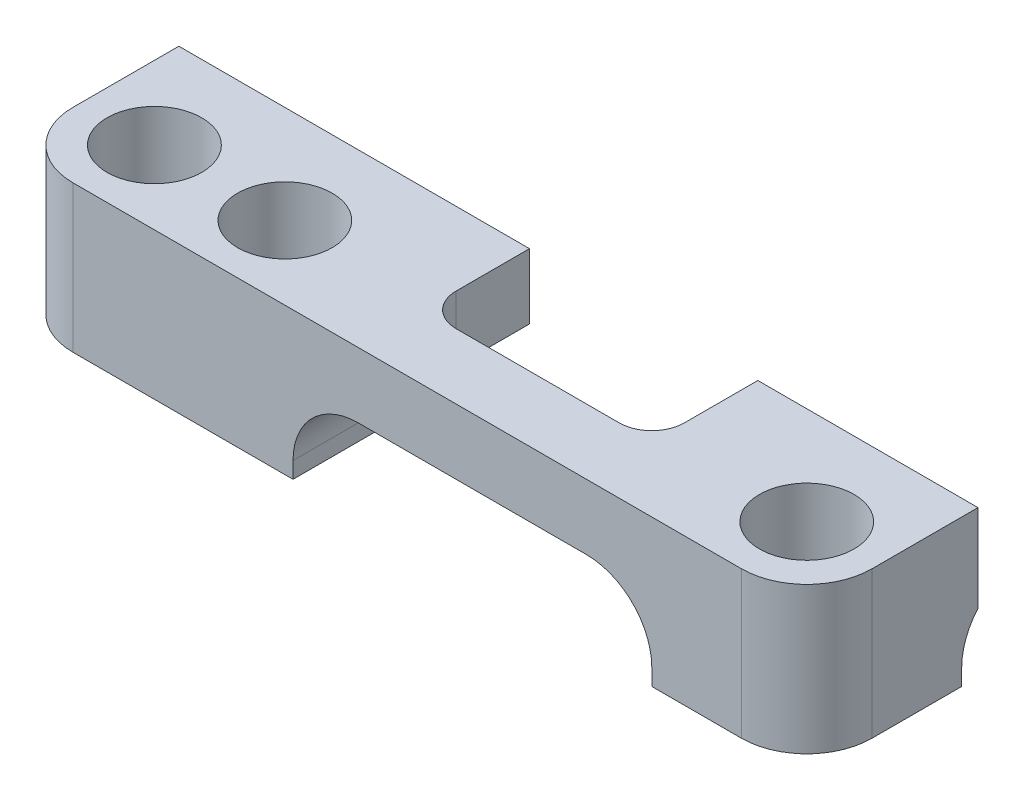
ISO-10303-21;
HEADER;
FILE_DESCRIPTION(('STEP AP214'),'2;1');
FILE_NAME('part.step','',(''),(''),'','','');
FILE_SCHEMA(('AUTOMOTIVE_DESIGN { 1 0 10303 214 1 1 1 1 }'));
ENDSEC;
DATA;
#1=APPLICATION_CONTEXT('core data for automotive mechanical design processes');
#2=APPLICATION_PROTOCOL_DEFINITION('international standard','automotive_design',2000,#1);
#3=PRODUCT_CONTEXT('',#1,'mechanical');
#4=PRODUCT('Part','Part','',(#3));
#5=PRODUCT_RELATED_PRODUCT_CATEGORY('part','',(#4));
#6=PRODUCT_DEFINITION_FORMATION('','',#4);
#7=PRODUCT_DEFINITION_CONTEXT('part definition',#1,'design');
#8=PRODUCT_DEFINITION('design','',#6,#7);
#9=PRODUCT_DEFINITION_SHAPE('','',#8);
#10=(LENGTH_UNIT() NAMED_UNIT(*) SI_UNIT(.MILLI.,.METRE.));
#11=(NAMED_UNIT(*) PLANE_ANGLE_UNIT() SI_UNIT($,.RADIAN.));
#12=(NAMED_UNIT(*) SI_UNIT($,.STERADIAN.) SOLID_ANGLE_UNIT());
#13=UNCERTAINTY_MEASURE_WITH_UNIT(LENGTH_MEASURE(1.E-05),#10,'distance_accuracy_value','');
#14=(GEOMETRIC_REPRESENTATION_CONTEXT(3) GLOBAL_UNCERTAINTY_ASSIGNED_CONTEXT((#13)) GLOBAL_UNIT_ASSIGNED_CONTEXT((#10,
#11,#12)) REPRESENTATION_CONTEXT('',''));
#15=CARTESIAN_POINT('',(0.,0.,0.));
#16=DIRECTION('',(0.,0.,1.));
#17=DIRECTION('',(1.,0.,0.));
#18=AXIS2_PLACEMENT_3D('',#15,#16,#17);
#19=CARTESIAN_POINT('',(0.,0.,0.));
#20=DIRECTION('',(0.,-1.,0.));
#21=DIRECTION('',(0.,0.,-1.));
#22=AXIS2_PLACEMENT_3D('',#19,#20,#21);
#23=PLANE('',#22);
#24=DIRECTION('',(1.,0.,0.));
#25=VECTOR('',#24,1.);
#26=CARTESIAN_POINT('',(10.25,0.,7.25));
#27=LINE('',#26,#25);
#28=CARTESIAN_POINT('',(-12.25,0.,7.25));
#29=VERTEX_POINT('',#28);
#30=CARTESIAN_POINT('',(-5.5,0.,7.25));
#31=VERTEX_POINT('',#30);
#32=EDGE_CURVE('E206',#29,#31,#27,.T.);
#33=ORIENTED_EDGE('',*,*,#32,.F.);
#34=CARTESIAN_POINT('',(-12.25,0.,5.25));
#35=DIRECTION('',(0.,-1.,0.));
#36=DIRECTION('',(0.,0.,-1.));
#37=AXIS2_PLACEMENT_3D('',#34,#35,#36);
#38=CIRCLE('',#37,2.);
#39=CARTESIAN_POINT('',(-14.25,0.,5.25));
#40=VERTEX_POINT('',#39);
#41=EDGE_CURVE('E247',#29,#40,#38,.T.);
#42=ORIENTED_EDGE('',*,*,#41,.T.);
#43=DIRECTION('',(0.,0.,1.));
#44=VECTOR('',#43,1.);
#45=CARTESIAN_POINT('',(-14.25,0.,7.25));
#46=LINE('',#45,#44);
#47=CARTESIAN_POINT('',(-14.25,0.,2.5));
#48=VERTEX_POINT('',#47);
#49=EDGE_CURVE('E212',#48,#40,#46,.T.);
#50=ORIENTED_EDGE('',*,*,#49,.F.);
#51=DIRECTION('',(-1.,0.,0.));
#52=VECTOR('',#51,1.);
#53=CARTESIAN_POINT('',(10.25,0.,2.5));
#54=LINE('',#53,#52);
#55=CARTESIAN_POINT('',(-5.5,0.,2.5));
#56=VERTEX_POINT('',#55);
#57=EDGE_CURVE('E327',#56,#48,#54,.T.);
#58=ORIENTED_EDGE('',*,*,#57,.F.);
#59=DIRECTION('',(0.,0.,1.));
#60=VECTOR('',#59,1.);
#61=CARTESIAN_POINT('',(-5.5,0.,-7.25));
#62=LINE('',#61,#60);
#63=EDGE_CURVE('E318',#56,#31,#62,.T.);
#64=ORIENTED_EDGE('',*,*,#63,.T.);
#65=EDGE_LOOP('',(#33,#42,#50,#58,#64));
#66=FACE_BOUND('',#65,.T.);
#67=CARTESIAN_POINT('',(-12.,0.,4.99999999999999));
#68=DIRECTION('',(0.,1.,0.));
#69=DIRECTION('',(0.,0.,1.));
#70=AXIS2_PLACEMENT_3D('',#67,#68,#69);
#71=CIRCLE('',#70,1.45208286644588);
#72=CARTESIAN_POINT('',(-12.,0.,6.45208286644587));
#73=VERTEX_POINT('',#72);
#74=EDGE_CURVE('E333',#73,#73,#71,.T.);
#75=ORIENTED_EDGE('',*,*,#74,.T.);
#76=EDGE_LOOP('',(#75));
#77=FACE_BOUND('',#76,.T.);
#78=CARTESIAN_POINT('',(-8.,0.,5.));
#79=DIRECTION('',(0.,1.,0.));
#80=DIRECTION('',(0.,0.,1.));
#81=AXIS2_PLACEMENT_3D('',#78,#79,#80);
#82=CIRCLE('',#81,1.45);
#83=CARTESIAN_POINT('',(-8.,0.,6.45));
#84=VERTEX_POINT('',#83);
#85=EDGE_CURVE('E343',#84,#84,#82,.T.);
#86=ORIENTED_EDGE('',*,*,#85,.T.);
#87=EDGE_LOOP('',(#86));
#88=FACE_BOUND('',#87,.T.);
#89=ADVANCED_FACE('F39',(#66,#77,#88),#23,.T.);
#90=CARTESIAN_POINT('',(10.25,0.,2.5));
#91=DIRECTION('',(0.,0.,1.));
#92=DIRECTION('',(1.,0.,0.));
#93=AXIS2_PLACEMENT_3D('',#90,#91,#92);
#94=PLANE('',#93);
#95=DIRECTION('',(0.,1.,0.));
#96=VECTOR('',#95,1.);
#97=CARTESIAN_POINT('',(-14.25,0.,2.5));
#98=LINE('',#97,#96);
#99=CARTESIAN_POINT('',(-14.25,0.5,2.5));
#100=VERTEX_POINT('',#99);
#101=EDGE_CURVE('E321',#48,#100,#98,.T.);
#102=ORIENTED_EDGE('',*,*,#101,.T.);
#103=DIRECTION('',(-1.,0.,0.));
#104=VECTOR('',#103,1.);
#105=CARTESIAN_POINT('',(-5.50000000000001,0.5,2.5));
#106=LINE('',#105,#104);
#107=CARTESIAN_POINT('',(-5.50000000000001,0.5,2.5));
#108=VERTEX_POINT('',#107);
#109=EDGE_CURVE('E270',#100,#108,#106,.F.);
#110=ORIENTED_EDGE('',*,*,#109,.T.);
#111=DIRECTION('',(0.,-1.,0.));
#112=VECTOR('',#111,1.);
#113=CARTESIAN_POINT('',(-5.50000000000001,0.,2.5));
#114=LINE('',#113,#112);
#115=EDGE_CURVE('E220',#108,#56,#114,.T.);
#116=ORIENTED_EDGE('',*,*,#115,.T.);
#117=ORIENTED_EDGE('',*,*,#57,.T.);
#118=EDGE_LOOP('',(#102,#110,#116,#117));
#119=FACE_BOUND('',#118,.T.);
#120=ADVANCED_FACE('F368',(#119),#94,.F.);
#121=CARTESIAN_POINT('',(0.,4.5,0.));
#122=DIRECTION('',(0.,-1.,0.));
#123=DIRECTION('',(0.,0.,-1.));
#124=AXIS2_PLACEMENT_3D('',#121,#122,#123);
#125=PLANE('',#124);
#126=DIRECTION('',(0.,0.,-1.));
#127=VECTOR('',#126,1.);
#128=CARTESIAN_POINT('',(10.25,4.5,-7.25));
#129=LINE('',#128,#127);
#130=CARTESIAN_POINT('',(10.25,4.5,5.25));
#131=VERTEX_POINT('',#130);
#132=CARTESIAN_POINT('',(10.25,4.5,2.));
#133=VERTEX_POINT('',#132);
#134=EDGE_CURVE('E201',#131,#133,#129,.T.);
#135=ORIENTED_EDGE('',*,*,#134,.T.);
#136=DIRECTION('',(1.,0.,0.));
#137=VECTOR('',#136,1.);
#138=CARTESIAN_POINT('',(-15.2422142422142,4.5,2.));
#139=LINE('',#138,#137);
#140=CARTESIAN_POINT('',(3.49999999999999,4.5,2.));
#141=VERTEX_POINT('',#140);
#142=EDGE_CURVE('E193',#141,#133,#139,.T.);
#143=ORIENTED_EDGE('',*,*,#142,.F.);
#144=DIRECTION('',(0.,0.,1.));
#145=VECTOR('',#144,1.);
#146=CARTESIAN_POINT('',(3.5,4.5,0.5));
#147=LINE('',#146,#145);
#148=CARTESIAN_POINT('',(3.5,4.5,4.25));
#149=VERTEX_POINT('',#148);
#150=EDGE_CURVE('E297',#141,#149,#147,.T.);
#151=ORIENTED_EDGE('',*,*,#150,.T.);
#152=CARTESIAN_POINT('',(2.5,4.5,4.25));
#153=DIRECTION('',(0.,-1.,0.));
#154=DIRECTION('',(0.,0.,-1.));
#155=AXIS2_PLACEMENT_3D('',#152,#153,#154);
#156=CIRCLE('',#155,1.);
#157=CARTESIAN_POINT('',(2.5,4.5,5.25));
#158=VERTEX_POINT('',#157);
#159=EDGE_CURVE('E236',#149,#158,#156,.T.);
#160=ORIENTED_EDGE('',*,*,#159,.T.);
#161=DIRECTION('',(-1.,0.,0.));
#162=VECTOR('',#161,1.);
#163=CARTESIAN_POINT('',(3.5,4.5,5.25));
#164=LINE('',#163,#162);
#165=CARTESIAN_POINT('',(-2.5,4.5,5.25));
#166=VERTEX_POINT('',#165);
#167=EDGE_CURVE('E299',#158,#166,#164,.T.);
#168=ORIENTED_EDGE('',*,*,#167,.T.);
#169=CARTESIAN_POINT('',(-2.5,4.5,4.25));
#170=DIRECTION('',(0.,-1.,0.));
#171=DIRECTION('',(0.,0.,-1.));
#172=AXIS2_PLACEMENT_3D('',#169,#170,#171);
#173=CIRCLE('',#172,1.);
#174=CARTESIAN_POINT('',(-3.5,4.5,4.25));
#175=VERTEX_POINT('',#174);
#176=EDGE_CURVE('E240',#166,#175,#173,.T.);
#177=ORIENTED_EDGE('',*,*,#176,.T.);
#178=DIRECTION('',(0.,0.,-1.));
#179=VECTOR('',#178,1.);
#180=CARTESIAN_POINT('',(-3.5,4.5,5.25));
#181=LINE('',#180,#179);
#182=CARTESIAN_POINT('',(-3.50000000000001,4.5,2.));
#183=VERTEX_POINT('',#182);
#184=EDGE_CURVE('E192',#175,#183,#181,.T.);
#185=ORIENTED_EDGE('',*,*,#184,.T.);
#186=CARTESIAN_POINT('',(-14.25,4.5,2.));
#187=VERTEX_POINT('',#186);
#188=EDGE_CURVE('E176',#187,#183,#139,.T.);
#189=ORIENTED_EDGE('',*,*,#188,.F.);
#190=DIRECTION('',(0.,0.,1.));
#191=VECTOR('',#190,1.);
#192=CARTESIAN_POINT('',(-14.25,4.5,7.25));
#193=LINE('',#192,#191);
#194=CARTESIAN_POINT('',(-14.25,4.5,5.25));
#195=VERTEX_POINT('',#194);
#196=EDGE_CURVE('E189',#187,#195,#193,.T.);
#197=ORIENTED_EDGE('',*,*,#196,.T.);
#198=CARTESIAN_POINT('',(-12.25,4.5,5.25));
#199=DIRECTION('',(0.,-1.,0.));
#200=DIRECTION('',(0.,0.,-1.));
#201=AXIS2_PLACEMENT_3D('',#198,#199,#200);
#202=CIRCLE('',#201,2.);
#203=CARTESIAN_POINT('',(-12.25,4.5,7.25));
#204=VERTEX_POINT('',#203);
#205=EDGE_CURVE('E252',#195,#204,#202,.F.);
#206=ORIENTED_EDGE('',*,*,#205,.T.);
#207=DIRECTION('',(1.,0.,0.));
#208=VECTOR('',#207,1.);
#209=CARTESIAN_POINT('',(-10.25,4.5,7.25));
#210=LINE('',#209,#208);
#211=CARTESIAN_POINT('',(8.25,4.5,7.25));
#212=VERTEX_POINT('',#211);
#213=EDGE_CURVE('E200',#204,#212,#210,.T.);
#214=ORIENTED_EDGE('',*,*,#213,.T.);
#215=CARTESIAN_POINT('',(8.25,4.5,5.25));
#216=DIRECTION('',(0.,-1.,0.));
#217=DIRECTION('',(0.,0.,-1.));
#218=AXIS2_PLACEMENT_3D('',#215,#216,#217);
#219=CIRCLE('',#218,2.);
#220=EDGE_CURVE('E250',#212,#131,#219,.F.);
#221=ORIENTED_EDGE('',*,*,#220,.T.);
#222=EDGE_LOOP('',(#135,#143,#151,#160,#168,#177,#185,#189,#197,#206,#214,#221));
#223=FACE_BOUND('',#222,.T.);
#224=CARTESIAN_POINT('',(-8.,4.5,5.));
#225=DIRECTION('',(0.,1.,0.));
#226=DIRECTION('',(0.,0.,1.));
#227=AXIS2_PLACEMENT_3D('',#224,#225,#226);
#228=CIRCLE('',#227,1.45);
#229=CARTESIAN_POINT('',(-8.,4.5,6.45));
#230=VERTEX_POINT('',#229);
#231=EDGE_CURVE('E213',#230,#230,#228,.T.);
#232=ORIENTED_EDGE('',*,*,#231,.F.);
#233=EDGE_LOOP('',(#232));
#234=FACE_BOUND('',#233,.T.);
#235=CARTESIAN_POINT('',(8.,4.5,5.));
#236=DIRECTION('',(0.,1.,0.));
#237=DIRECTION('',(0.,0.,-1.));
#238=AXIS2_PLACEMENT_3D('',#235,#236,#237);
#239=CIRCLE('',#238,1.45);
#240=CARTESIAN_POINT('',(8.,4.5,3.55));
#241=VERTEX_POINT('',#240);
#242=EDGE_CURVE('E340',#241,#241,#239,.T.);
#243=ORIENTED_EDGE('',*,*,#242,.F.);
#244=EDGE_LOOP('',(#243));
#245=FACE_BOUND('',#244,.T.);
#246=CARTESIAN_POINT('',(-12.,4.5,4.99999999999999));
#247=DIRECTION('',(0.,1.,0.));
#248=DIRECTION('',(0.,0.,1.));
#249=AXIS2_PLACEMENT_3D('',#246,#247,#248);
#250=CIRCLE('',#249,1.45208286644588);
#251=CARTESIAN_POINT('',(-12.,4.5,6.45208286644587));
#252=VERTEX_POINT('',#251);
#253=EDGE_CURVE('E334',#252,#252,#250,.T.);
#254=ORIENTED_EDGE('',*,*,#253,.F.);
#255=EDGE_LOOP('',(#254));
#256=FACE_BOUND('',#255,.T.);
#257=ADVANCED_FACE('F187',(#223,#234,#245,#256),#125,.F.);
#258=DIRECTION('',(0.,0.,-1.));
#259=VECTOR('',#258,1.);
#260=CARTESIAN_POINT('',(10.25,0.,-7.25));
#261=LINE('',#260,#259);
#262=CARTESIAN_POINT('',(10.25,0.,5.25));
#263=VERTEX_POINT('',#262);
#264=CARTESIAN_POINT('',(10.25,0.,2.5));
#265=VERTEX_POINT('',#264);
#266=EDGE_CURVE('E210',#263,#265,#261,.T.);
#267=ORIENTED_EDGE('',*,*,#266,.F.);
#268=CARTESIAN_POINT('',(8.25,0.,5.25));
#269=DIRECTION('',(0.,-1.,0.));
#270=DIRECTION('',(0.,0.,-1.));
#271=AXIS2_PLACEMENT_3D('',#268,#269,#270);
#272=CIRCLE('',#271,2.);
#273=CARTESIAN_POINT('',(8.25,0.,7.25));
#274=VERTEX_POINT('',#273);
#275=EDGE_CURVE('E257',#263,#274,#272,.T.);
#276=ORIENTED_EDGE('',*,*,#275,.T.);
#277=CARTESIAN_POINT('',(5.5,0.,7.25));
#278=VERTEX_POINT('',#277);
#279=EDGE_CURVE('E215',#278,#274,#27,.T.);
#280=ORIENTED_EDGE('',*,*,#279,.F.);
#281=DIRECTION('',(0.,0.,1.));
#282=VECTOR('',#281,1.);
#283=CARTESIAN_POINT('',(5.5,0.,-7.25));
#284=LINE('',#283,#282);
#285=CARTESIAN_POINT('',(5.5,0.,2.5));
#286=VERTEX_POINT('',#285);
#287=EDGE_CURVE('E319',#286,#278,#284,.T.);
#288=ORIENTED_EDGE('',*,*,#287,.F.);
#289=EDGE_CURVE('E330',#265,#286,#54,.T.);
#290=ORIENTED_EDGE('',*,*,#289,.F.);
#291=EDGE_LOOP('',(#267,#276,#280,#288,#290));
#292=FACE_BOUND('',#291,.T.);
#293=CARTESIAN_POINT('',(8.,0.,5.));
#294=DIRECTION('',(0.,1.,0.));
#295=DIRECTION('',(0.,0.,-1.));
#296=AXIS2_PLACEMENT_3D('',#293,#294,#295);
#297=CIRCLE('',#296,1.45);
#298=CARTESIAN_POINT('',(8.,0.,3.55));
#299=VERTEX_POINT('',#298);
#300=EDGE_CURVE('E337',#299,#299,#297,.T.);
#301=ORIENTED_EDGE('',*,*,#300,.T.);
#302=EDGE_LOOP('',(#301));
#303=FACE_BOUND('',#302,.T.);
#304=ADVANCED_FACE('F371',(#292,#303),#23,.T.);
#305=CARTESIAN_POINT('',(10.25,4.5,-7.25));
#306=DIRECTION('',(-1.,0.,0.));
#307=DIRECTION('',(0.,0.,1.));
#308=AXIS2_PLACEMENT_3D('',#305,#306,#307);
#309=PLANE('',#308);
#310=CARTESIAN_POINT('',(10.25,0.5,0.5));
#311=DIRECTION('',(-1.,0.,0.));
#312=DIRECTION('',(0.,0.,1.));
#313=AXIS2_PLACEMENT_3D('',#310,#311,#312);
#314=CIRCLE('',#313,2.);
#315=CARTESIAN_POINT('',(10.25,0.5,2.5));
#316=VERTEX_POINT('',#315);
#317=CARTESIAN_POINT('',(10.25,1.8228756555323,2.));
#318=VERTEX_POINT('',#317);
#319=EDGE_CURVE('E272',#316,#318,#314,.T.);
#320=ORIENTED_EDGE('',*,*,#319,.T.);
#321=DIRECTION('',(0.,1.,0.));
#322=VECTOR('',#321,1.);
#323=CARTESIAN_POINT('',(10.25,4.5,2.));
#324=LINE('',#323,#322);
#325=EDGE_CURVE('E54',#318,#133,#324,.T.);
#326=ORIENTED_EDGE('',*,*,#325,.T.);
#327=ORIENTED_EDGE('',*,*,#134,.F.);
#328=DIRECTION('',(0.,-1.,0.));
#329=VECTOR('',#328,1.);
#330=CARTESIAN_POINT('',(10.25,4.5,5.25));
#331=LINE('',#330,#329);
#332=EDGE_CURVE('E254',#131,#263,#331,.T.);
#333=ORIENTED_EDGE('',*,*,#332,.T.);
#334=ORIENTED_EDGE('',*,*,#266,.T.);
#335=DIRECTION('',(0.,1.,0.));
#336=VECTOR('',#335,1.);
#337=CARTESIAN_POINT('',(10.25,0.,2.5));
#338=LINE('',#337,#336);
#339=EDGE_CURVE('E324',#265,#316,#338,.T.);
#340=ORIENTED_EDGE('',*,*,#339,.T.);
#341=EDGE_LOOP('',(#320,#326,#327,#333,#334,#340));
#342=FACE_BOUND('',#341,.T.);
#343=ADVANCED_FACE('F382',(#342),#309,.F.);
#344=CARTESIAN_POINT('',(-14.25,4.5,7.25));
#345=DIRECTION('',(1.,0.,0.));
#346=DIRECTION('',(0.,0.,-1.));
#347=AXIS2_PLACEMENT_3D('',#344,#345,#346);
#348=PLANE('',#347);
#349=ORIENTED_EDGE('',*,*,#196,.F.);
#350=DIRECTION('',(0.,-1.,0.));
#351=VECTOR('',#350,1.);
#352=CARTESIAN_POINT('',(-14.25,4.5,2.));
#353=LINE('',#352,#351);
#354=CARTESIAN_POINT('',(-14.25,1.8228756555323,2.));
#355=VERTEX_POINT('',#354);
#356=EDGE_CURVE('E173',#187,#355,#353,.T.);
#357=ORIENTED_EDGE('',*,*,#356,.T.);
#358=CARTESIAN_POINT('',(-14.25,0.5,0.5));
#359=DIRECTION('',(1.,0.,0.));
#360=DIRECTION('',(0.,0.,-1.));
#361=AXIS2_PLACEMENT_3D('',#358,#359,#360);
#362=CIRCLE('',#361,2.);
#363=EDGE_CURVE('E47',#355,#100,#362,.T.);
#364=ORIENTED_EDGE('',*,*,#363,.T.);
#365=ORIENTED_EDGE('',*,*,#101,.F.);
#366=ORIENTED_EDGE('',*,*,#49,.T.);
#367=DIRECTION('',(0.,-1.,0.));
#368=VECTOR('',#367,1.);
#369=CARTESIAN_POINT('',(-14.25,4.5,5.25));
#370=LINE('',#369,#368);
#371=EDGE_CURVE('E198',#40,#195,#370,.F.);
#372=ORIENTED_EDGE('',*,*,#371,.T.);
#373=EDGE_LOOP('',(#349,#357,#364,#365,#366,#372));
#374=FACE_BOUND('',#373,.T.);
#375=ADVANCED_FACE('F195',(#374),#348,.F.);
#376=CARTESIAN_POINT('',(10.25,4.5,7.25));
#377=DIRECTION('',(0.,0.,-1.));
#378=DIRECTION('',(-1.,0.,0.));
#379=AXIS2_PLACEMENT_3D('',#376,#377,#378);
#380=PLANE('',#379);
#381=ORIENTED_EDGE('',*,*,#213,.F.);
#382=DIRECTION('',(0.,-1.,0.));
#383=VECTOR('',#382,1.);
#384=CARTESIAN_POINT('',(-12.25,4.5,7.25));
#385=LINE('',#384,#383);
#386=EDGE_CURVE('E244',#204,#29,#385,.T.);
#387=ORIENTED_EDGE('',*,*,#386,.T.);
#388=ORIENTED_EDGE('',*,*,#32,.T.);
#389=DIRECTION('',(0.,-1.,0.));
#390=VECTOR('',#389,1.);
#391=CARTESIAN_POINT('',(-5.5,0.,7.25));
#392=LINE('',#391,#390);
#393=CARTESIAN_POINT('',(-5.5,0.5,7.25));
#394=VERTEX_POINT('',#393);
#395=EDGE_CURVE('E304',#394,#31,#392,.T.);
#396=ORIENTED_EDGE('',*,*,#395,.F.);
#397=CARTESIAN_POINT('',(-3.5,0.5,7.25));
#398=DIRECTION('',(0.,0.,-1.));
#399=DIRECTION('',(-1.,0.,0.));
#400=AXIS2_PLACEMENT_3D('',#397,#398,#399);
#401=CIRCLE('',#400,2.);
#402=CARTESIAN_POINT('',(-3.5,2.5,7.25));
#403=VERTEX_POINT('',#402);
#404=EDGE_CURVE('E277',#394,#403,#401,.T.);
#405=ORIENTED_EDGE('',*,*,#404,.T.);
#406=DIRECTION('',(-1.,0.,0.));
#407=VECTOR('',#406,1.);
#408=CARTESIAN_POINT('',(-5.5,2.5,7.25));
#409=LINE('',#408,#407);
#410=CARTESIAN_POINT('',(3.5,2.5,7.25));
#411=VERTEX_POINT('',#410);
#412=EDGE_CURVE('E315',#411,#403,#409,.T.);
#413=ORIENTED_EDGE('',*,*,#412,.F.);
#414=CARTESIAN_POINT('',(3.5,0.5,7.25));
#415=DIRECTION('',(0.,0.,-1.));
#416=DIRECTION('',(-1.,0.,0.));
#417=AXIS2_PLACEMENT_3D('',#414,#415,#416);
#418=CIRCLE('',#417,2.);
#419=CARTESIAN_POINT('',(5.5,0.5,7.25));
#420=VERTEX_POINT('',#419);
#421=EDGE_CURVE('E275',#411,#420,#418,.T.);
#422=ORIENTED_EDGE('',*,*,#421,.T.);
#423=DIRECTION('',(0.,1.,0.));
#424=VECTOR('',#423,1.);
#425=CARTESIAN_POINT('',(5.5,0.,7.25));
#426=LINE('',#425,#424);
#427=EDGE_CURVE('E312',#278,#420,#426,.T.);
#428=ORIENTED_EDGE('',*,*,#427,.F.);
#429=ORIENTED_EDGE('',*,*,#279,.T.);
#430=DIRECTION('',(0.,-1.,0.));
#431=VECTOR('',#430,1.);
#432=CARTESIAN_POINT('',(8.25,4.5,7.25));
#433=LINE('',#432,#431);
#434=EDGE_CURVE('E242',#274,#212,#433,.F.);
#435=ORIENTED_EDGE('',*,*,#434,.T.);
#436=EDGE_LOOP('',(#381,#387,#388,#396,#405,#413,#422,#428,#429,#435));
#437=FACE_BOUND('',#436,.T.);
#438=ADVANCED_FACE('F354',(#437),#380,.F.);
#439=CARTESIAN_POINT('',(-8.,4.5,5.));
#440=DIRECTION('',(0.,-1.,0.));
#441=DIRECTION('',(0.,0.,-1.));
#442=AXIS2_PLACEMENT_3D('',#439,#440,#441);
#443=CYLINDRICAL_SURFACE('',#442,1.45);
#444=ORIENTED_EDGE('',*,*,#231,.T.);
#445=EDGE_LOOP('',(#444));
#446=FACE_BOUND('',#445,.T.);
#447=ORIENTED_EDGE('',*,*,#85,.F.);
#448=EDGE_LOOP('',(#447));
#449=FACE_BOUND('',#448,.T.);
#450=ADVANCED_FACE('F351',(#446,#449),#443,.F.);
#451=CARTESIAN_POINT('',(8.,4.5,5.));
#452=DIRECTION('',(0.,-1.,0.));
#453=DIRECTION('',(0.,0.,-1.));
#454=AXIS2_PLACEMENT_3D('',#451,#452,#453);
#455=CYLINDRICAL_SURFACE('',#454,1.45);
#456=ORIENTED_EDGE('',*,*,#242,.T.);
#457=EDGE_LOOP('',(#456));
#458=FACE_BOUND('',#457,.T.);
#459=ORIENTED_EDGE('',*,*,#300,.F.);
#460=EDGE_LOOP('',(#459));
#461=FACE_BOUND('',#460,.T.);
#462=ADVANCED_FACE('F353',(#458,#461),#455,.F.);
#463=CARTESIAN_POINT('',(-12.,4.5,4.99999999999999));
#464=DIRECTION('',(0.,-1.,0.));
#465=DIRECTION('',(0.,0.,-1.));
#466=AXIS2_PLACEMENT_3D('',#463,#464,#465);
#467=CYLINDRICAL_SURFACE('',#466,1.45208286644588);
#468=ORIENTED_EDGE('',*,*,#253,.T.);
#469=EDGE_LOOP('',(#468));
#470=FACE_BOUND('',#469,.T.);
#471=ORIENTED_EDGE('',*,*,#74,.F.);
#472=EDGE_LOOP('',(#471));
#473=FACE_BOUND('',#472,.T.);
#474=ADVANCED_FACE('F360',(#470,#473),#467,.F.);
#475=CARTESIAN_POINT('',(10.25,2.5,-5.25));
#476=DIRECTION('',(0.,1.,0.));
#477=DIRECTION('',(0.,0.,1.));
#478=AXIS2_PLACEMENT_3D('',#475,#476,#477);
#479=PLANE('',#478);
#480=CARTESIAN_POINT('',(2.5,2.5,4.25));
#481=DIRECTION('',(0.,1.,0.));
#482=DIRECTION('',(0.,0.,1.));
#483=AXIS2_PLACEMENT_3D('',#480,#481,#482);
#484=CIRCLE('',#483,1.);
#485=CARTESIAN_POINT('',(2.5,2.5,5.25));
#486=VERTEX_POINT('',#485);
#487=CARTESIAN_POINT('',(3.5,2.5,4.25));
#488=VERTEX_POINT('',#487);
#489=EDGE_CURVE('E233',#486,#488,#484,.T.);
#490=ORIENTED_EDGE('',*,*,#489,.T.);
#491=DIRECTION('',(0.,0.,1.));
#492=VECTOR('',#491,1.);
#493=CARTESIAN_POINT('',(3.5,2.5,7.25));
#494=LINE('',#493,#492);
#495=EDGE_CURVE('E261',#488,#411,#494,.T.);
#496=ORIENTED_EDGE('',*,*,#495,.T.);
#497=ORIENTED_EDGE('',*,*,#412,.T.);
#498=DIRECTION('',(0.,0.,1.));
#499=VECTOR('',#498,1.);
#500=CARTESIAN_POINT('',(-3.5,2.5,2.5));
#501=LINE('',#500,#499);
#502=CARTESIAN_POINT('',(-3.5,2.5,4.25));
#503=VERTEX_POINT('',#502);
#504=EDGE_CURVE('E259',#403,#503,#501,.F.);
#505=ORIENTED_EDGE('',*,*,#504,.T.);
#506=CARTESIAN_POINT('',(-2.5,2.5,4.25));
#507=DIRECTION('',(0.,1.,0.));
#508=DIRECTION('',(0.,0.,1.));
#509=AXIS2_PLACEMENT_3D('',#506,#507,#508);
#510=CIRCLE('',#509,1.);
#511=CARTESIAN_POINT('',(-2.5,2.5,5.25));
#512=VERTEX_POINT('',#511);
#513=EDGE_CURVE('E238',#503,#512,#510,.T.);
#514=ORIENTED_EDGE('',*,*,#513,.T.);
#515=DIRECTION('',(-1.,0.,0.));
#516=VECTOR('',#515,1.);
#517=CARTESIAN_POINT('',(3.5,2.5,5.25));
#518=LINE('',#517,#516);
#519=EDGE_CURVE('E306',#486,#512,#518,.T.);
#520=ORIENTED_EDGE('',*,*,#519,.F.);
#521=EDGE_LOOP('',(#490,#496,#497,#505,#514,#520));
#522=FACE_BOUND('',#521,.T.);
#523=ADVANCED_FACE('F558',(#522),#479,.F.);
#524=DIRECTION('',(0.,1.,0.));
#525=VECTOR('',#524,1.);
#526=CARTESIAN_POINT('',(5.5,0.,2.5));
#527=LINE('',#526,#525);
#528=CARTESIAN_POINT('',(5.5,0.5,2.5));
#529=VERTEX_POINT('',#528);
#530=EDGE_CURVE('E204',#286,#529,#527,.T.);
#531=ORIENTED_EDGE('',*,*,#530,.T.);
#532=DIRECTION('',(-1.,0.,0.));
#533=VECTOR('',#532,1.);
#534=CARTESIAN_POINT('',(10.25,0.5,2.5));
#535=LINE('',#534,#533);
#536=EDGE_CURVE('E263',#529,#316,#535,.F.);
#537=ORIENTED_EDGE('',*,*,#536,.T.);
#538=ORIENTED_EDGE('',*,*,#339,.F.);
#539=ORIENTED_EDGE('',*,*,#289,.T.);
#540=EDGE_LOOP('',(#531,#537,#538,#539));
#541=FACE_BOUND('',#540,.T.);
#542=ADVANCED_FACE('F379',(#541),#94,.F.);
#543=CARTESIAN_POINT('',(5.5,0.,-7.25));
#544=DIRECTION('',(1.,0.,0.));
#545=DIRECTION('',(0.,0.,-1.));
#546=AXIS2_PLACEMENT_3D('',#543,#544,#545);
#547=PLANE('',#546);
#548=ORIENTED_EDGE('',*,*,#427,.T.);
#549=DIRECTION('',(0.,0.,1.));
#550=VECTOR('',#549,1.);
#551=CARTESIAN_POINT('',(5.5,0.5,2.5));
#552=LINE('',#551,#550);
#553=EDGE_CURVE('E265',#420,#529,#552,.F.);
#554=ORIENTED_EDGE('',*,*,#553,.T.);
#555=ORIENTED_EDGE('',*,*,#530,.F.);
#556=ORIENTED_EDGE('',*,*,#287,.T.);
#557=EDGE_LOOP('',(#548,#554,#555,#556));
#558=FACE_BOUND('',#557,.T.);
#559=ADVANCED_FACE('F540',(#558),#547,.F.);
#560=CARTESIAN_POINT('',(-5.5,0.,-7.25));
#561=DIRECTION('',(-1.,0.,0.));
#562=DIRECTION('',(0.,0.,1.));
#563=AXIS2_PLACEMENT_3D('',#560,#561,#562);
#564=PLANE('',#563);
#565=ORIENTED_EDGE('',*,*,#115,.F.);
#566=DIRECTION('',(0.,0.,1.));
#567=VECTOR('',#566,1.);
#568=CARTESIAN_POINT('',(-5.5,0.5,7.25));
#569=LINE('',#568,#567);
#570=EDGE_CURVE('E267',#108,#394,#569,.T.);
#571=ORIENTED_EDGE('',*,*,#570,.T.);
#572=ORIENTED_EDGE('',*,*,#395,.T.);
#573=ORIENTED_EDGE('',*,*,#63,.F.);
#574=EDGE_LOOP('',(#565,#571,#572,#573));
#575=FACE_BOUND('',#574,.T.);
#576=ADVANCED_FACE('F501',(#575),#564,.F.);
#577=CARTESIAN_POINT('',(-3.5,4.5,5.25));
#578=DIRECTION('',(-1.,0.,0.));
#579=DIRECTION('',(0.,0.,1.));
#580=AXIS2_PLACEMENT_3D('',#577,#578,#579);
#581=PLANE('',#580);
#582=DIRECTION('',(0.,0.,-1.));
#583=VECTOR('',#582,1.);
#584=CARTESIAN_POINT('',(-3.5,2.5,5.25));
#585=LINE('',#584,#583);
#586=CARTESIAN_POINT('',(-3.5,2.5,2.));
#587=VERTEX_POINT('',#586);
#588=EDGE_CURVE('E300',#503,#587,#585,.T.);
#589=ORIENTED_EDGE('',*,*,#588,.T.);
#590=DIRECTION('',(0.,1.,0.));
#591=VECTOR('',#590,1.);
#592=CARTESIAN_POINT('',(-3.5,4.5,2.));
#593=LINE('',#592,#591);
#594=EDGE_CURVE('E62',#587,#183,#593,.T.);
#595=ORIENTED_EDGE('',*,*,#594,.T.);
#596=ORIENTED_EDGE('',*,*,#184,.F.);
#597=DIRECTION('',(0.,-1.,0.));
#598=VECTOR('',#597,1.);
#599=CARTESIAN_POINT('',(-3.5,2.5,4.25));
#600=LINE('',#599,#598);
#601=EDGE_CURVE('E230',#175,#503,#600,.T.);
#602=ORIENTED_EDGE('',*,*,#601,.T.);
#603=EDGE_LOOP('',(#589,#595,#596,#602));
#604=FACE_BOUND('',#603,.T.);
#605=ADVANCED_FACE('F437',(#604),#581,.F.);
#606=CARTESIAN_POINT('',(3.5,4.5,5.25));
#607=DIRECTION('',(0.,0.,1.));
#608=DIRECTION('',(1.,0.,0.));
#609=AXIS2_PLACEMENT_3D('',#606,#607,#608);
#610=PLANE('',#609);
#611=ORIENTED_EDGE('',*,*,#167,.F.);
#612=DIRECTION('',(0.,-1.,0.));
#613=VECTOR('',#612,1.);
#614=CARTESIAN_POINT('',(2.5,2.5,5.25));
#615=LINE('',#614,#613);
#616=EDGE_CURVE('E224',#158,#486,#615,.T.);
#617=ORIENTED_EDGE('',*,*,#616,.T.);
#618=ORIENTED_EDGE('',*,*,#519,.T.);
#619=DIRECTION('',(0.,-1.,0.));
#620=VECTOR('',#619,1.);
#621=CARTESIAN_POINT('',(-2.5,4.5,5.25));
#622=LINE('',#621,#620);
#623=EDGE_CURVE('E222',#512,#166,#622,.F.);
#624=ORIENTED_EDGE('',*,*,#623,.T.);
#625=EDGE_LOOP('',(#611,#617,#618,#624));
#626=FACE_BOUND('',#625,.T.);
#627=ADVANCED_FACE('F429',(#626),#610,.F.);
#628=CARTESIAN_POINT('',(3.5,4.5,0.5));
#629=DIRECTION('',(1.,0.,0.));
#630=DIRECTION('',(0.,0.,-1.));
#631=AXIS2_PLACEMENT_3D('',#628,#629,#630);
#632=PLANE('',#631);
#633=ORIENTED_EDGE('',*,*,#150,.F.);
#634=DIRECTION('',(0.,-1.,0.));
#635=VECTOR('',#634,1.);
#636=CARTESIAN_POINT('',(3.5,4.5,2.));
#637=LINE('',#636,#635);
#638=CARTESIAN_POINT('',(3.5,2.5,2.));
#639=VERTEX_POINT('',#638);
#640=EDGE_CURVE('E288',#141,#639,#637,.T.);
#641=ORIENTED_EDGE('',*,*,#640,.T.);
#642=DIRECTION('',(0.,0.,1.));
#643=VECTOR('',#642,1.);
#644=CARTESIAN_POINT('',(3.5,2.5,0.5));
#645=LINE('',#644,#643);
#646=EDGE_CURVE('E282',#639,#488,#645,.T.);
#647=ORIENTED_EDGE('',*,*,#646,.T.);
#648=DIRECTION('',(0.,-1.,0.));
#649=VECTOR('',#648,1.);
#650=CARTESIAN_POINT('',(3.5,4.5,4.25));
#651=LINE('',#650,#649);
#652=EDGE_CURVE('E227',#488,#149,#651,.F.);
#653=ORIENTED_EDGE('',*,*,#652,.T.);
#654=EDGE_LOOP('',(#633,#641,#647,#653));
#655=FACE_BOUND('',#654,.T.);
#656=ADVANCED_FACE('F420',(#655),#632,.F.);
#657=CARTESIAN_POINT('',(2.5,4.5,4.25));
#658=DIRECTION('',(0.,1.,0.));
#659=DIRECTION('',(0.,0.,1.));
#660=AXIS2_PLACEMENT_3D('',#657,#658,#659);
#661=CYLINDRICAL_SURFACE('',#660,1.);
#662=ORIENTED_EDGE('',*,*,#159,.F.);
#663=ORIENTED_EDGE('',*,*,#652,.F.);
#664=ORIENTED_EDGE('',*,*,#489,.F.);
#665=ORIENTED_EDGE('',*,*,#616,.F.);
#666=EDGE_LOOP('',(#662,#663,#664,#665));
#667=FACE_BOUND('',#666,.T.);
#668=ADVANCED_FACE('F425',(#667),#661,.F.);
#669=CARTESIAN_POINT('',(-2.5,4.5,4.25));
#670=DIRECTION('',(0.,1.,0.));
#671=DIRECTION('',(0.,0.,1.));
#672=AXIS2_PLACEMENT_3D('',#669,#670,#671);
#673=CYLINDRICAL_SURFACE('',#672,1.);
#674=ORIENTED_EDGE('',*,*,#176,.F.);
#675=ORIENTED_EDGE('',*,*,#623,.F.);
#676=ORIENTED_EDGE('',*,*,#513,.F.);
#677=ORIENTED_EDGE('',*,*,#601,.F.);
#678=EDGE_LOOP('',(#674,#675,#676,#677));
#679=FACE_BOUND('',#678,.T.);
#680=ADVANCED_FACE('F434',(#679),#673,.F.);
#681=CARTESIAN_POINT('',(-12.25,4.5,5.25));
#682=DIRECTION('',(0.,-1.,0.));
#683=DIRECTION('',(0.,0.,-1.));
#684=AXIS2_PLACEMENT_3D('',#681,#682,#683);
#685=CYLINDRICAL_SURFACE('',#684,2.);
#686=ORIENTED_EDGE('',*,*,#205,.F.);
#687=ORIENTED_EDGE('',*,*,#371,.F.);
#688=ORIENTED_EDGE('',*,*,#41,.F.);
#689=ORIENTED_EDGE('',*,*,#386,.F.);
#690=EDGE_LOOP('',(#686,#687,#688,#689));
#691=FACE_BOUND('',#690,.T.);
#692=ADVANCED_FACE('F449',(#691),#685,.T.);
#693=CARTESIAN_POINT('',(8.25,4.5,5.25));
#694=DIRECTION('',(0.,-1.,0.));
#695=DIRECTION('',(0.,0.,-1.));
#696=AXIS2_PLACEMENT_3D('',#693,#694,#695);
#697=CYLINDRICAL_SURFACE('',#696,2.);
#698=ORIENTED_EDGE('',*,*,#220,.F.);
#699=ORIENTED_EDGE('',*,*,#434,.F.);
#700=ORIENTED_EDGE('',*,*,#275,.F.);
#701=ORIENTED_EDGE('',*,*,#332,.F.);
#702=EDGE_LOOP('',(#698,#699,#700,#701));
#703=FACE_BOUND('',#702,.T.);
#704=ADVANCED_FACE('F456',(#703),#697,.T.);
#705=CARTESIAN_POINT('',(3.5,0.5,-5.25));
#706=DIRECTION('',(0.,0.,-1.));
#707=DIRECTION('',(-1.,0.,0.));
#708=AXIS2_PLACEMENT_3D('',#705,#706,#707);
#709=CYLINDRICAL_SURFACE('',#708,2.);
#710=ORIENTED_EDGE('',*,*,#646,.F.);
#711=CARTESIAN_POINT('',(3.5,0.5,2.));
#712=DIRECTION('',(0.,0.,1.));
#713=DIRECTION('',(1.,0.,0.));
#714=AXIS2_PLACEMENT_3D('',#711,#712,#713);
#715=CIRCLE('',#714,2.);
#716=CARTESIAN_POINT('',(4.99999999999999,1.8228756555323,2.));
#717=VERTEX_POINT('',#716);
#718=EDGE_CURVE('E293',#639,#717,#715,.F.);
#719=ORIENTED_EDGE('',*,*,#718,.T.);
#720=CARTESIAN_POINT('',(3.5,0.5,0.5));
#721=DIRECTION('',(0.707106781186547,0.,-0.707106781186547));
#722=DIRECTION('',(0.707106781186547,0.,0.707106781186547));
#723=AXIS2_PLACEMENT_3D('',#720,#721,#722);
#724=ELLIPSE('',#723,2.82842712474619,2.);
#725=EDGE_CURVE('E280',#529,#717,#724,.F.);
#726=ORIENTED_EDGE('',*,*,#725,.F.);
#727=ORIENTED_EDGE('',*,*,#553,.F.);
#728=ORIENTED_EDGE('',*,*,#421,.F.);
#729=ORIENTED_EDGE('',*,*,#495,.F.);
#730=EDGE_LOOP('',(#710,#719,#726,#727,#728,#729));
#731=FACE_BOUND('',#730,.T.);
#732=ADVANCED_FACE('F410',(#731),#709,.F.);
#733=CARTESIAN_POINT('',(10.25,0.5,0.5));
#734=DIRECTION('',(1.,0.,0.));
#735=DIRECTION('',(0.,0.,-1.));
#736=AXIS2_PLACEMENT_3D('',#733,#734,#735);
#737=CYLINDRICAL_SURFACE('',#736,2.);
#738=ORIENTED_EDGE('',*,*,#725,.T.);
#739=DIRECTION('',(1.,0.,0.));
#740=VECTOR('',#739,1.);
#741=CARTESIAN_POINT('',(10.25,1.8228756555323,2.));
#742=LINE('',#741,#740);
#743=EDGE_CURVE('E182',#717,#318,#742,.T.);
#744=ORIENTED_EDGE('',*,*,#743,.T.);
#745=ORIENTED_EDGE('',*,*,#319,.F.);
#746=ORIENTED_EDGE('',*,*,#536,.F.);
#747=EDGE_LOOP('',(#738,#744,#745,#746));
#748=FACE_BOUND('',#747,.T.);
#749=ADVANCED_FACE('F405',(#748),#737,.F.);
#750=CARTESIAN_POINT('',(10.25,0.5,0.5));
#751=DIRECTION('',(1.,0.,0.));
#752=DIRECTION('',(0.,0.,-1.));
#753=AXIS2_PLACEMENT_3D('',#750,#751,#752);
#754=CYLINDRICAL_SURFACE('',#753,2.);
#755=ORIENTED_EDGE('',*,*,#363,.F.);
#756=DIRECTION('',(1.,0.,0.));
#757=VECTOR('',#756,1.);
#758=CARTESIAN_POINT('',(10.25,1.8228756555323,2.));
#759=LINE('',#758,#757);
#760=CARTESIAN_POINT('',(-5.,1.8228756555323,2.));
#761=VERTEX_POINT('',#760);
#762=EDGE_CURVE('E178',#355,#761,#759,.T.);
#763=ORIENTED_EDGE('',*,*,#762,.T.);
#764=CARTESIAN_POINT('',(-3.5,0.5,0.5));
#765=DIRECTION('',(-0.707106781186547,0.,-0.707106781186547));
#766=DIRECTION('',(0.707106781186547,0.,-0.707106781186547));
#767=AXIS2_PLACEMENT_3D('',#764,#765,#766);
#768=ELLIPSE('',#767,2.82842712474619,2.);
#769=EDGE_CURVE('E283',#108,#761,#768,.T.);
#770=ORIENTED_EDGE('',*,*,#769,.F.);
#771=ORIENTED_EDGE('',*,*,#109,.F.);
#772=EDGE_LOOP('',(#755,#763,#770,#771));
#773=FACE_BOUND('',#772,.T.);
#774=ADVANCED_FACE('F41',(#773),#754,.F.);
#775=CARTESIAN_POINT('',(-3.5,0.5,-7.25));
#776=DIRECTION('',(0.,0.,-1.));
#777=DIRECTION('',(-1.,0.,0.));
#778=AXIS2_PLACEMENT_3D('',#775,#776,#777);
#779=CYLINDRICAL_SURFACE('',#778,2.);
#780=ORIENTED_EDGE('',*,*,#769,.T.);
#781=CARTESIAN_POINT('',(-3.5,0.5,2.));
#782=DIRECTION('',(0.,0.,1.));
#783=DIRECTION('',(1.,0.,0.));
#784=AXIS2_PLACEMENT_3D('',#781,#782,#783);
#785=CIRCLE('',#784,2.);
#786=EDGE_CURVE('E11',#761,#587,#785,.F.);
#787=ORIENTED_EDGE('',*,*,#786,.T.);
#788=ORIENTED_EDGE('',*,*,#588,.F.);
#789=ORIENTED_EDGE('',*,*,#504,.F.);
#790=ORIENTED_EDGE('',*,*,#404,.F.);
#791=ORIENTED_EDGE('',*,*,#570,.F.);
#792=EDGE_LOOP('',(#780,#787,#788,#789,#790,#791));
#793=FACE_BOUND('',#792,.T.);
#794=ADVANCED_FACE('F440',(#793),#779,.F.);
#795=CARTESIAN_POINT('',(-15.2422142422142,0.,2.));
#796=DIRECTION('',(0.,0.,1.));
#797=DIRECTION('',(1.,0.,0.));
#798=AXIS2_PLACEMENT_3D('',#795,#796,#797);
#799=PLANE('',#798);
#800=ORIENTED_EDGE('',*,*,#188,.T.);
#801=ORIENTED_EDGE('',*,*,#594,.F.);
#802=ORIENTED_EDGE('',*,*,#786,.F.);
#803=ORIENTED_EDGE('',*,*,#762,.F.);
#804=ORIENTED_EDGE('',*,*,#356,.F.);
#805=EDGE_LOOP('',(#800,#801,#802,#803,#804));
#806=FACE_BOUND('',#805,.T.);
#807=ADVANCED_FACE('F175',(#806),#799,.F.);
#808=ORIENTED_EDGE('',*,*,#743,.F.);
#809=ORIENTED_EDGE('',*,*,#718,.F.);
#810=ORIENTED_EDGE('',*,*,#640,.F.);
#811=ORIENTED_EDGE('',*,*,#142,.T.);
#812=ORIENTED_EDGE('',*,*,#325,.F.);
#813=EDGE_LOOP('',(#808,#809,#810,#811,#812));
#814=FACE_BOUND('',#813,.T.);
#815=ADVANCED_FACE('F417',(#814),#799,.F.);
#816=CLOSED_SHELL('',(#89,#120,#257,#304,#343,#375,#438,#450,#462,#474,#523,#542,#559,#576,#605,
#627,#656,#668,#680,#692,#704,#732,#749,#774,#794,#807,#815));
#817=MANIFOLD_SOLID_BREP('B2',#816);
#818=ADVANCED_BREP_SHAPE_REPRESENTATION('',(#18,#817),#14);
#819=SHAPE_DEFINITION_REPRESENTATION(#9,#818);
ENDSEC;
END-ISO-10303-21;
